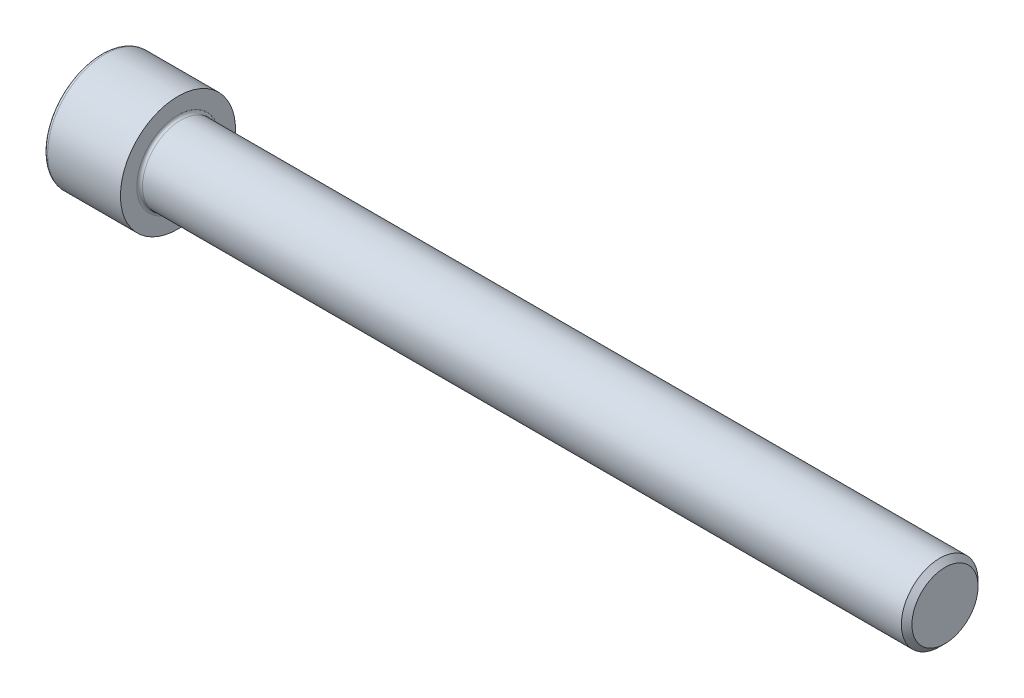
ISO-10303-21;
HEADER;
FILE_DESCRIPTION(('STEP AP214'),'2;1');
FILE_NAME('part.step','',(''),(''),'','','');
FILE_SCHEMA(('AUTOMOTIVE_DESIGN { 1 0 10303 214 1 1 1 1 }'));
ENDSEC;
DATA;
#1=APPLICATION_CONTEXT('core data for automotive mechanical design processes');
#2=APPLICATION_PROTOCOL_DEFINITION('international standard','automotive_design',2000,#1);
#3=PRODUCT_CONTEXT('',#1,'mechanical');
#4=PRODUCT('Part','Part','',(#3));
#5=PRODUCT_RELATED_PRODUCT_CATEGORY('part','',(#4));
#6=PRODUCT_DEFINITION_FORMATION('','',#4);
#7=PRODUCT_DEFINITION_CONTEXT('part definition',#1,'design');
#8=PRODUCT_DEFINITION('design','',#6,#7);
#9=PRODUCT_DEFINITION_SHAPE('','',#8);
#10=(LENGTH_UNIT() NAMED_UNIT(*) SI_UNIT(.MILLI.,.METRE.));
#11=(NAMED_UNIT(*) PLANE_ANGLE_UNIT() SI_UNIT($,.RADIAN.));
#12=(NAMED_UNIT(*) SI_UNIT($,.STERADIAN.) SOLID_ANGLE_UNIT());
#13=UNCERTAINTY_MEASURE_WITH_UNIT(LENGTH_MEASURE(1.E-05),#10,'distance_accuracy_value','');
#14=(GEOMETRIC_REPRESENTATION_CONTEXT(3) GLOBAL_UNCERTAINTY_ASSIGNED_CONTEXT((#13)) GLOBAL_UNIT_ASSIGNED_CONTEXT((#10,
#11,#12)) REPRESENTATION_CONTEXT('',''));
#15=CARTESIAN_POINT('',(0.,0.,0.));
#16=DIRECTION('',(0.,0.,1.));
#17=DIRECTION('',(1.,0.,0.));
#18=AXIS2_PLACEMENT_3D('',#15,#16,#17);
#19=CARTESIAN_POINT('',(0.,0.,0.));
#20=DIRECTION('',(-1.,0.,0.));
#21=DIRECTION('',(0.,0.,1.));
#22=AXIS2_PLACEMENT_3D('',#19,#20,#21);
#23=PLANE('',#22);
#24=DIRECTION('',(0.,-0.5,0.866025403784439));
#25=VECTOR('',#24,1.);
#26=CARTESIAN_POINT('',(0.,8.16488750687969,0.));
#27=LINE('',#26,#25);
#28=CARTESIAN_POINT('',(0.,8.16488750687969,0.));
#29=VERTEX_POINT('',#28);
#30=CARTESIAN_POINT('',(0.,4.08244375343984,7.071));
#31=VERTEX_POINT('',#30);
#32=EDGE_CURVE('E258',#29,#31,#27,.T.);
#33=ORIENTED_EDGE('',*,*,#32,.T.);
#34=DIRECTION('',(0.,1.,0.));
#35=VECTOR('',#34,1.);
#36=CARTESIAN_POINT('',(0.,-4.08244375343985,7.07100000000001));
#37=LINE('',#36,#35);
#38=CARTESIAN_POINT('',(0.,-4.08244375343985,7.07100000000001));
#39=VERTEX_POINT('',#38);
#40=EDGE_CURVE('E130',#39,#31,#37,.T.);
#41=ORIENTED_EDGE('',*,*,#40,.F.);
#42=DIRECTION('',(0.,-0.500000000000001,-0.866025403784438));
#43=VECTOR('',#42,1.);
#44=CARTESIAN_POINT('',(0.,-4.08244375343985,7.07100000000001));
#45=LINE('',#44,#43);
#46=CARTESIAN_POINT('',(0.,-8.1648875068797,0.));
#47=VERTEX_POINT('',#46);
#48=EDGE_CURVE('E261',#39,#47,#45,.T.);
#49=ORIENTED_EDGE('',*,*,#48,.T.);
#50=DIRECTION('',(0.,0.499999999999999,-0.866025403784439));
#51=VECTOR('',#50,1.);
#52=CARTESIAN_POINT('',(0.,-8.1648875068797,0.));
#53=LINE('',#52,#51);
#54=CARTESIAN_POINT('',(0.,-4.08244375343986,-7.071));
#55=VERTEX_POINT('',#54);
#56=EDGE_CURVE('E264',#47,#55,#53,.T.);
#57=ORIENTED_EDGE('',*,*,#56,.T.);
#58=DIRECTION('',(0.,-1.,0.));
#59=VECTOR('',#58,1.);
#60=CARTESIAN_POINT('',(0.,4.08244375343983,-7.07100000000001));
#61=LINE('',#60,#59);
#62=CARTESIAN_POINT('',(0.,4.08244375343983,-7.07100000000001));
#63=VERTEX_POINT('',#62);
#64=EDGE_CURVE('E267',#63,#55,#61,.T.);
#65=ORIENTED_EDGE('',*,*,#64,.F.);
#66=DIRECTION('',(0.,-0.500000000000001,-0.866025403784438));
#67=VECTOR('',#66,1.);
#68=CARTESIAN_POINT('',(0.,8.16488750687969,0.));
#69=LINE('',#68,#67);
#70=EDGE_CURVE('E125',#29,#63,#69,.T.);
#71=ORIENTED_EDGE('',*,*,#70,.F.);
#72=EDGE_LOOP('',(#33,#41,#49,#57,#65,#71));
#73=FACE_BOUND('',#72,.T.);
#74=CARTESIAN_POINT('',(0.,0.,0.));
#75=DIRECTION('',(-1.,0.,0.));
#76=DIRECTION('',(0.,0.,1.));
#77=AXIS2_PLACEMENT_3D('',#74,#75,#76);
#78=CIRCLE('',#77,11.2);
#79=CARTESIAN_POINT('',(0.,0.,11.2));
#80=VERTEX_POINT('',#79);
#81=EDGE_CURVE('E42',#80,#80,#78,.T.);
#82=ORIENTED_EDGE('',*,*,#81,.T.);
#83=EDGE_LOOP('',(#82));
#84=FACE_BOUND('',#83,.T.);
#85=ADVANCED_FACE('F34',(#73,#84),#23,.T.);
#86=CARTESIAN_POINT('',(-31.75,0.,0.));
#87=DIRECTION('',(-1.,0.,0.));
#88=DIRECTION('',(0.,0.,1.));
#89=AXIS2_PLACEMENT_3D('',#86,#87,#88);
#90=CYLINDRICAL_SURFACE('',#89,12.);
#91=CARTESIAN_POINT('',(0.800000000000002,0.,0.));
#92=DIRECTION('',(-1.,0.,0.));
#93=DIRECTION('',(0.,0.,1.));
#94=AXIS2_PLACEMENT_3D('',#91,#92,#93);
#95=CIRCLE('',#94,12.);
#96=CARTESIAN_POINT('',(0.800000000000002,0.,12.));
#97=VERTEX_POINT('',#96);
#98=EDGE_CURVE('E11',#97,#97,#95,.F.);
#99=ORIENTED_EDGE('',*,*,#98,.T.);
#100=EDGE_LOOP('',(#99));
#101=FACE_BOUND('',#100,.T.);
#102=CARTESIAN_POINT('',(16.,0.,0.));
#103=DIRECTION('',(-1.,0.,0.));
#104=DIRECTION('',(0.,0.,1.));
#105=AXIS2_PLACEMENT_3D('',#102,#103,#104);
#106=CIRCLE('',#105,12.);
#107=CARTESIAN_POINT('',(16.,0.,12.));
#108=VERTEX_POINT('',#107);
#109=EDGE_CURVE('E148',#108,#108,#106,.T.);
#110=ORIENTED_EDGE('',*,*,#109,.T.);
#111=EDGE_LOOP('',(#110));
#112=FACE_BOUND('',#111,.T.);
#113=ADVANCED_FACE('F172',(#101,#112),#90,.T.);
#114=CARTESIAN_POINT('',(16.,12.,0.));
#115=DIRECTION('',(1.,0.,0.));
#116=DIRECTION('',(0.,0.,-1.));
#117=AXIS2_PLACEMENT_3D('',#114,#115,#116);
#118=PLANE('',#117);
#119=CARTESIAN_POINT('',(16.,0.,0.));
#120=DIRECTION('',(1.,0.,0.));
#121=DIRECTION('',(0.,0.,-1.));
#122=AXIS2_PLACEMENT_3D('',#119,#120,#121);
#123=CIRCLE('',#122,8.6);
#124=CARTESIAN_POINT('',(16.,0.,-8.6));
#125=VERTEX_POINT('',#124);
#126=EDGE_CURVE('E151',#125,#125,#123,.F.);
#127=ORIENTED_EDGE('',*,*,#126,.T.);
#128=EDGE_LOOP('',(#127));
#129=FACE_BOUND('',#128,.T.);
#130=ORIENTED_EDGE('',*,*,#109,.F.);
#131=EDGE_LOOP('',(#130));
#132=FACE_BOUND('',#131,.T.);
#133=ADVANCED_FACE('F178',(#129,#132),#118,.T.);
#134=CARTESIAN_POINT('',(-31.75,0.,0.));
#135=DIRECTION('',(-1.,0.,0.));
#136=DIRECTION('',(0.,0.,1.));
#137=AXIS2_PLACEMENT_3D('',#134,#135,#136);
#138=CYLINDRICAL_SURFACE('',#137,8.);
#139=CARTESIAN_POINT('',(16.6,0.,0.));
#140=DIRECTION('',(1.,0.,0.));
#141=DIRECTION('',(0.,0.,-1.));
#142=AXIS2_PLACEMENT_3D('',#139,#140,#141);
#143=CIRCLE('',#142,8.);
#144=CARTESIAN_POINT('',(16.6,0.,-8.));
#145=VERTEX_POINT('',#144);
#146=EDGE_CURVE('E154',#145,#145,#143,.T.);
#147=ORIENTED_EDGE('',*,*,#146,.T.);
#148=EDGE_LOOP('',(#147));
#149=FACE_BOUND('',#148,.T.);
#150=CARTESIAN_POINT('',(174.8985,0.,0.));
#151=DIRECTION('',(-1.,0.,0.));
#152=DIRECTION('',(0.,0.,1.));
#153=AXIS2_PLACEMENT_3D('',#150,#151,#152);
#154=CIRCLE('',#153,8.);
#155=CARTESIAN_POINT('',(174.8985,0.,8.));
#156=VERTEX_POINT('',#155);
#157=EDGE_CURVE('E145',#156,#156,#154,.T.);
#158=ORIENTED_EDGE('',*,*,#157,.T.);
#159=EDGE_LOOP('',(#158));
#160=FACE_BOUND('',#159,.T.);
#161=ADVANCED_FACE('F184',(#149,#160),#138,.T.);
#162=CARTESIAN_POINT('',(176.,0.,0.));
#163=DIRECTION('',(-1.,0.,0.));
#164=DIRECTION('',(0.,0.,1.));
#165=AXIS2_PLACEMENT_3D('',#162,#163,#164);
#166=CONICAL_SURFACE('',#165,6.8985,0.785398163397485);
#167=ORIENTED_EDGE('',*,*,#157,.F.);
#168=EDGE_LOOP('',(#167));
#169=FACE_BOUND('',#168,.T.);
#170=CARTESIAN_POINT('',(176.,0.,0.));
#171=DIRECTION('',(-1.,0.,0.));
#172=DIRECTION('',(0.,0.,1.));
#173=AXIS2_PLACEMENT_3D('',#170,#171,#172);
#174=CIRCLE('',#173,6.8985);
#175=CARTESIAN_POINT('',(176.,0.,6.8985));
#176=VERTEX_POINT('',#175);
#177=EDGE_CURVE('E141',#176,#176,#174,.T.);
#178=ORIENTED_EDGE('',*,*,#177,.T.);
#179=EDGE_LOOP('',(#178));
#180=FACE_BOUND('',#179,.T.);
#181=ADVANCED_FACE('F188',(#169,#180),#166,.T.);
#182=CARTESIAN_POINT('',(176.,6.8985,0.));
#183=DIRECTION('',(1.,0.,0.));
#184=DIRECTION('',(0.,0.,-1.));
#185=AXIS2_PLACEMENT_3D('',#182,#183,#184);
#186=PLANE('',#185);
#187=ORIENTED_EDGE('',*,*,#177,.F.);
#188=EDGE_LOOP('',(#187));
#189=FACE_BOUND('',#188,.T.);
#190=ADVANCED_FACE('F168',(#189),#186,.T.);
#191=CARTESIAN_POINT('',(16.6,0.,0.));
#192=DIRECTION('',(1.,0.,0.));
#193=DIRECTION('',(0.,0.,-1.));
#194=AXIS2_PLACEMENT_3D('',#191,#192,#193);
#195=TOROIDAL_SURFACE('',#194,8.6,0.6);
#196=ORIENTED_EDGE('',*,*,#146,.F.);
#197=EDGE_LOOP('',(#196));
#198=FACE_BOUND('',#197,.T.);
#199=ORIENTED_EDGE('',*,*,#126,.F.);
#200=EDGE_LOOP('',(#199));
#201=FACE_BOUND('',#200,.T.);
#202=ADVANCED_FACE('F161',(#198,#201),#195,.F.);
#203=CARTESIAN_POINT('',(0.800000000000002,0.,0.));
#204=DIRECTION('',(-1.,0.,0.));
#205=DIRECTION('',(0.,0.,1.));
#206=AXIS2_PLACEMENT_3D('',#203,#204,#205);
#207=TOROIDAL_SURFACE('',#206,11.2,0.8);
#208=ORIENTED_EDGE('',*,*,#98,.F.);
#209=EDGE_LOOP('',(#208));
#210=FACE_BOUND('',#209,.T.);
#211=ORIENTED_EDGE('',*,*,#81,.F.);
#212=EDGE_LOOP('',(#211));
#213=FACE_BOUND('',#212,.T.);
#214=ADVANCED_FACE('F36',(#210,#213),#207,.T.);
#215=CARTESIAN_POINT('',(8.,8.16488750687969,0.));
#216=DIRECTION('',(0.,-0.866025403784439,-0.5));
#217=DIRECTION('',(0.,0.5,-0.866025403784439));
#218=AXIS2_PLACEMENT_3D('',#215,#216,#217);
#219=PLANE('',#218);
#220=ORIENTED_EDGE('',*,*,#32,.F.);
#221=DIRECTION('',(-1.,0.,0.));
#222=VECTOR('',#221,1.);
#223=CARTESIAN_POINT('',(8.,8.16488750687969,0.));
#224=LINE('',#223,#222);
#225=CARTESIAN_POINT('',(8.,8.16488750687969,0.));
#226=VERTEX_POINT('',#225);
#227=EDGE_CURVE('E248',#226,#29,#224,.T.);
#228=ORIENTED_EDGE('',*,*,#227,.F.);
#229=DIRECTION('',(0.,-0.5,0.866025403784439));
#230=VECTOR('',#229,1.);
#231=CARTESIAN_POINT('',(8.,8.16488750687969,0.));
#232=LINE('',#231,#230);
#233=CARTESIAN_POINT('',(8.,6.12366563015976,3.5355));
#234=VERTEX_POINT('',#233);
#235=EDGE_CURVE('E117',#226,#234,#232,.T.);
#236=ORIENTED_EDGE('',*,*,#235,.T.);
#237=CARTESIAN_POINT('',(8.,4.08244375343984,7.071));
#238=VERTEX_POINT('',#237);
#239=EDGE_CURVE('E108',#234,#238,#232,.T.);
#240=ORIENTED_EDGE('',*,*,#239,.T.);
#241=DIRECTION('',(-1.,0.,0.));
#242=VECTOR('',#241,1.);
#243=CARTESIAN_POINT('',(8.,4.08244375343984,7.071));
#244=LINE('',#243,#242);
#245=EDGE_CURVE('E122',#238,#31,#244,.T.);
#246=ORIENTED_EDGE('',*,*,#245,.T.);
#247=EDGE_LOOP('',(#220,#228,#236,#240,#246));
#248=FACE_BOUND('',#247,.T.);
#249=ADVANCED_FACE('F121',(#248),#219,.T.);
#250=CARTESIAN_POINT('',(8.,-4.08244375343985,7.07100000000001));
#251=DIRECTION('',(0.,0.,1.));
#252=DIRECTION('',(0.,-1.,0.));
#253=AXIS2_PLACEMENT_3D('',#250,#251,#252);
#254=PLANE('',#253);
#255=ORIENTED_EDGE('',*,*,#40,.T.);
#256=ORIENTED_EDGE('',*,*,#245,.F.);
#257=DIRECTION('',(0.,1.,0.));
#258=VECTOR('',#257,1.);
#259=CARTESIAN_POINT('',(8.,-4.08244375343985,7.07100000000001));
#260=LINE('',#259,#258);
#261=CARTESIAN_POINT('',(8.,0.,7.071));
#262=VERTEX_POINT('',#261);
#263=EDGE_CURVE('E105',#262,#238,#260,.T.);
#264=ORIENTED_EDGE('',*,*,#263,.F.);
#265=CARTESIAN_POINT('',(8.,-4.08244375343985,7.07100000000001));
#266=VERTEX_POINT('',#265);
#267=EDGE_CURVE('E116',#266,#262,#260,.T.);
#268=ORIENTED_EDGE('',*,*,#267,.F.);
#269=DIRECTION('',(-1.,0.,0.));
#270=VECTOR('',#269,1.);
#271=CARTESIAN_POINT('',(8.,-4.08244375343985,7.07100000000001));
#272=LINE('',#271,#270);
#273=EDGE_CURVE('E132',#266,#39,#272,.T.);
#274=ORIENTED_EDGE('',*,*,#273,.T.);
#275=EDGE_LOOP('',(#255,#256,#264,#268,#274));
#276=FACE_BOUND('',#275,.T.);
#277=ADVANCED_FACE('F127',(#276),#254,.F.);
#278=CARTESIAN_POINT('',(8.,-4.08244375343985,7.07100000000001));
#279=DIRECTION('',(0.,0.866025403784438,-0.500000000000001));
#280=DIRECTION('',(0.,0.500000000000001,0.866025403784438));
#281=AXIS2_PLACEMENT_3D('',#278,#279,#280);
#282=PLANE('',#281);
#283=ORIENTED_EDGE('',*,*,#48,.F.);
#284=ORIENTED_EDGE('',*,*,#273,.F.);
#285=DIRECTION('',(0.,-0.500000000000001,-0.866025403784438));
#286=VECTOR('',#285,1.);
#287=CARTESIAN_POINT('',(8.,-4.08244375343985,7.07100000000001));
#288=LINE('',#287,#286);
#289=CARTESIAN_POINT('',(8.,-6.12366563015977,3.53550000000001));
#290=VERTEX_POINT('',#289);
#291=EDGE_CURVE('E287',#266,#290,#288,.T.);
#292=ORIENTED_EDGE('',*,*,#291,.T.);
#293=CARTESIAN_POINT('',(8.,-8.1648875068797,0.));
#294=VERTEX_POINT('',#293);
#295=EDGE_CURVE('E276',#290,#294,#288,.T.);
#296=ORIENTED_EDGE('',*,*,#295,.T.);
#297=DIRECTION('',(-1.,0.,0.));
#298=VECTOR('',#297,1.);
#299=CARTESIAN_POINT('',(8.,-8.1648875068797,0.));
#300=LINE('',#299,#298);
#301=EDGE_CURVE('E137',#294,#47,#300,.T.);
#302=ORIENTED_EDGE('',*,*,#301,.T.);
#303=EDGE_LOOP('',(#283,#284,#292,#296,#302));
#304=FACE_BOUND('',#303,.T.);
#305=ADVANCED_FACE('F202',(#304),#282,.T.);
#306=CARTESIAN_POINT('',(8.,-8.1648875068797,0.));
#307=DIRECTION('',(0.,0.866025403784439,0.499999999999999));
#308=DIRECTION('',(0.,-0.499999999999999,0.866025403784439));
#309=AXIS2_PLACEMENT_3D('',#306,#307,#308);
#310=PLANE('',#309);
#311=ORIENTED_EDGE('',*,*,#56,.F.);
#312=ORIENTED_EDGE('',*,*,#301,.F.);
#313=DIRECTION('',(0.,0.499999999999999,-0.866025403784439));
#314=VECTOR('',#313,1.);
#315=CARTESIAN_POINT('',(8.,-8.1648875068797,0.));
#316=LINE('',#315,#314);
#317=CARTESIAN_POINT('',(8.,-6.12366563015978,-3.5355));
#318=VERTEX_POINT('',#317);
#319=EDGE_CURVE('E254',#294,#318,#316,.T.);
#320=ORIENTED_EDGE('',*,*,#319,.T.);
#321=CARTESIAN_POINT('',(8.,-4.08244375343986,-7.071));
#322=VERTEX_POINT('',#321);
#323=EDGE_CURVE('E286',#318,#322,#316,.T.);
#324=ORIENTED_EDGE('',*,*,#323,.T.);
#325=DIRECTION('',(-1.,0.,0.));
#326=VECTOR('',#325,1.);
#327=CARTESIAN_POINT('',(8.,-4.08244375343986,-7.071));
#328=LINE('',#327,#326);
#329=EDGE_CURVE('E247',#322,#55,#328,.T.);
#330=ORIENTED_EDGE('',*,*,#329,.T.);
#331=EDGE_LOOP('',(#311,#312,#320,#324,#330));
#332=FACE_BOUND('',#331,.T.);
#333=ADVANCED_FACE('F205',(#332),#310,.T.);
#334=CARTESIAN_POINT('',(8.,4.08244375343983,-7.07100000000001));
#335=DIRECTION('',(0.,0.,-1.));
#336=DIRECTION('',(0.,1.,0.));
#337=AXIS2_PLACEMENT_3D('',#334,#335,#336);
#338=PLANE('',#337);
#339=ORIENTED_EDGE('',*,*,#64,.T.);
#340=ORIENTED_EDGE('',*,*,#329,.F.);
#341=DIRECTION('',(0.,-1.,0.));
#342=VECTOR('',#341,1.);
#343=CARTESIAN_POINT('',(8.,4.08244375343983,-7.07100000000001));
#344=LINE('',#343,#342);
#345=CARTESIAN_POINT('',(8.,0.,-7.071));
#346=VERTEX_POINT('',#345);
#347=EDGE_CURVE('E251',#346,#322,#344,.T.);
#348=ORIENTED_EDGE('',*,*,#347,.F.);
#349=CARTESIAN_POINT('',(8.,4.08244375343983,-7.07100000000001));
#350=VERTEX_POINT('',#349);
#351=EDGE_CURVE('E49',#350,#346,#344,.T.);
#352=ORIENTED_EDGE('',*,*,#351,.F.);
#353=DIRECTION('',(-1.,0.,0.));
#354=VECTOR('',#353,1.);
#355=CARTESIAN_POINT('',(8.,4.08244375343983,-7.07100000000001));
#356=LINE('',#355,#354);
#357=EDGE_CURVE('E244',#350,#63,#356,.T.);
#358=ORIENTED_EDGE('',*,*,#357,.T.);
#359=EDGE_LOOP('',(#339,#340,#348,#352,#358));
#360=FACE_BOUND('',#359,.T.);
#361=ADVANCED_FACE('F209',(#360),#338,.F.);
#362=CARTESIAN_POINT('',(8.,8.16488750687969,0.));
#363=DIRECTION('',(0.,0.866025403784438,-0.500000000000001));
#364=DIRECTION('',(0.,0.500000000000001,0.866025403784438));
#365=AXIS2_PLACEMENT_3D('',#362,#363,#364);
#366=PLANE('',#365);
#367=ORIENTED_EDGE('',*,*,#70,.T.);
#368=ORIENTED_EDGE('',*,*,#357,.F.);
#369=DIRECTION('',(0.,-0.500000000000001,-0.866025403784438));
#370=VECTOR('',#369,1.);
#371=CARTESIAN_POINT('',(8.,8.16488750687969,0.));
#372=LINE('',#371,#370);
#373=CARTESIAN_POINT('',(8.,6.12366563015976,-3.53550000000001));
#374=VERTEX_POINT('',#373);
#375=EDGE_CURVE('E234',#374,#350,#372,.T.);
#376=ORIENTED_EDGE('',*,*,#375,.F.);
#377=EDGE_CURVE('E240',#226,#374,#372,.T.);
#378=ORIENTED_EDGE('',*,*,#377,.F.);
#379=ORIENTED_EDGE('',*,*,#227,.T.);
#380=EDGE_LOOP('',(#367,#368,#376,#378,#379));
#381=FACE_BOUND('',#380,.T.);
#382=ADVANCED_FACE('F213',(#381),#366,.F.);
#383=CARTESIAN_POINT('',(8.,8.16488750687969,0.));
#384=DIRECTION('',(1.,0.,0.));
#385=DIRECTION('',(0.,0.,-1.));
#386=AXIS2_PLACEMENT_3D('',#383,#384,#385);
#387=PLANE('',#386);
#388=ORIENTED_EDGE('',*,*,#347,.T.);
#389=ORIENTED_EDGE('',*,*,#323,.F.);
#390=CARTESIAN_POINT('',(8.,0.,0.));
#391=DIRECTION('',(-1.,0.,0.));
#392=DIRECTION('',(0.,0.,1.));
#393=AXIS2_PLACEMENT_3D('',#390,#391,#392);
#394=CIRCLE('',#393,7.071);
#395=EDGE_CURVE('E282',#346,#318,#394,.T.);
#396=ORIENTED_EDGE('',*,*,#395,.F.);
#397=EDGE_LOOP('',(#388,#389,#396));
#398=FACE_BOUND('',#397,.T.);
#399=ADVANCED_FACE('F217',(#398),#387,.F.);
#400=ORIENTED_EDGE('',*,*,#319,.F.);
#401=ORIENTED_EDGE('',*,*,#295,.F.);
#402=EDGE_CURVE('E135',#318,#290,#394,.T.);
#403=ORIENTED_EDGE('',*,*,#402,.F.);
#404=EDGE_LOOP('',(#400,#401,#403));
#405=FACE_BOUND('',#404,.T.);
#406=ADVANCED_FACE('F220',(#405),#387,.F.);
#407=ORIENTED_EDGE('',*,*,#291,.F.);
#408=ORIENTED_EDGE('',*,*,#267,.T.);
#409=EDGE_CURVE('E131',#290,#262,#394,.T.);
#410=ORIENTED_EDGE('',*,*,#409,.F.);
#411=EDGE_LOOP('',(#407,#408,#410));
#412=FACE_BOUND('',#411,.T.);
#413=ADVANCED_FACE('F225',(#412),#387,.F.);
#414=ORIENTED_EDGE('',*,*,#263,.T.);
#415=ORIENTED_EDGE('',*,*,#239,.F.);
#416=EDGE_CURVE('E111',#262,#234,#394,.T.);
#417=ORIENTED_EDGE('',*,*,#416,.F.);
#418=EDGE_LOOP('',(#414,#415,#417));
#419=FACE_BOUND('',#418,.T.);
#420=ADVANCED_FACE('F107',(#419),#387,.F.);
#421=ORIENTED_EDGE('',*,*,#235,.F.);
#422=ORIENTED_EDGE('',*,*,#377,.T.);
#423=EDGE_CURVE('E142',#234,#374,#394,.T.);
#424=ORIENTED_EDGE('',*,*,#423,.F.);
#425=EDGE_LOOP('',(#421,#422,#424));
#426=FACE_BOUND('',#425,.T.);
#427=ADVANCED_FACE('F228',(#426),#387,.F.);
#428=ORIENTED_EDGE('',*,*,#375,.T.);
#429=ORIENTED_EDGE('',*,*,#351,.T.);
#430=EDGE_CURVE('E237',#374,#346,#394,.T.);
#431=ORIENTED_EDGE('',*,*,#430,.F.);
#432=EDGE_LOOP('',(#428,#429,#431));
#433=FACE_BOUND('',#432,.T.);
#434=ADVANCED_FACE('F198',(#433),#387,.F.);
#435=CARTESIAN_POINT('',(8.,0.,0.));
#436=DIRECTION('',(-1.,0.,0.));
#437=DIRECTION('',(0.,0.,1.));
#438=AXIS2_PLACEMENT_3D('',#435,#436,#437);
#439=CONICAL_SURFACE('',#438,7.071,1.04719755119659);
#440=CARTESIAN_POINT('',(12.0824437534399,0.,0.));
#441=VERTEX_POINT('',#440);
#442=VERTEX_LOOP('',#441);
#443=FACE_BOUND('',#442,.T.);
#444=ORIENTED_EDGE('',*,*,#416,.T.);
#445=ORIENTED_EDGE('',*,*,#423,.T.);
#446=ORIENTED_EDGE('',*,*,#430,.T.);
#447=ORIENTED_EDGE('',*,*,#395,.T.);
#448=ORIENTED_EDGE('',*,*,#402,.T.);
#449=ORIENTED_EDGE('',*,*,#409,.T.);
#450=EDGE_LOOP('',(#444,#445,#446,#447,#448,#449));
#451=FACE_BOUND('',#450,.T.);
#452=ADVANCED_FACE('F196',(#443,#451),#439,.F.);
#453=CLOSED_SHELL('',(#85,#113,#133,#161,#181,#190,#202,#214,#249,#277,#305,#333,#361,#382,#399,
#406,#413,#420,#427,#434,#452));
#454=MANIFOLD_SOLID_BREP('B2',#453);
#455=ADVANCED_BREP_SHAPE_REPRESENTATION('',(#18,#454),#14);
#456=SHAPE_DEFINITION_REPRESENTATION(#9,#455);
ENDSEC;
END-ISO-10303-21;
